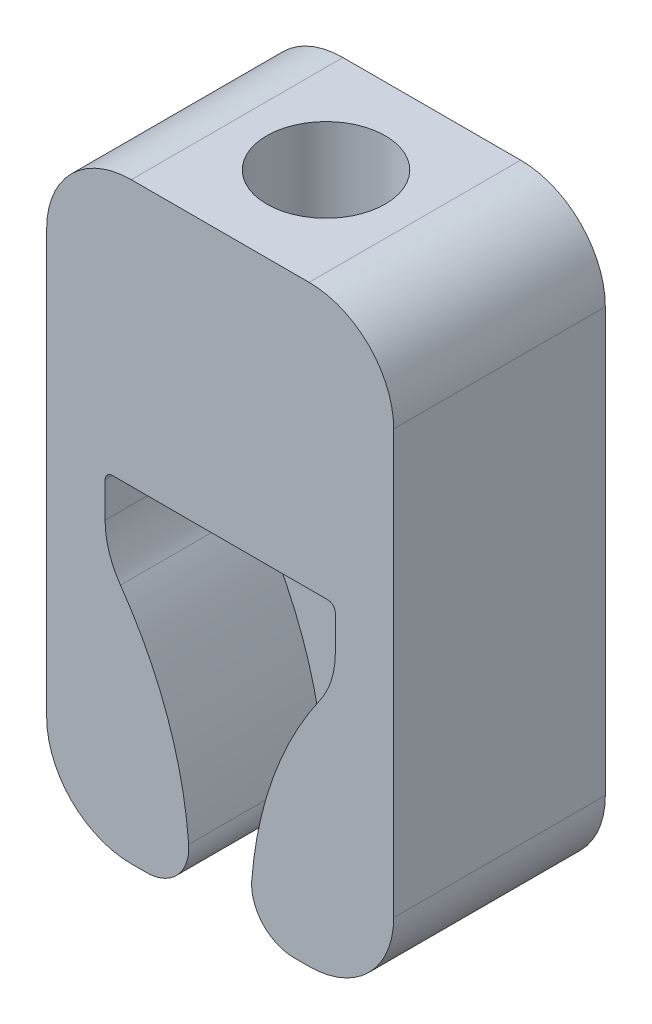
ISO-10303-21;
HEADER;
FILE_DESCRIPTION(('STEP AP214'),'2;1');
FILE_NAME('part.step','',(''),(''),'','','');
FILE_SCHEMA(('AUTOMOTIVE_DESIGN { 1 0 10303 214 1 1 1 1 }'));
ENDSEC;
DATA;
#1=APPLICATION_CONTEXT('core data for automotive mechanical design processes');
#2=APPLICATION_PROTOCOL_DEFINITION('international standard','automotive_design',2000,#1);
#3=PRODUCT_CONTEXT('',#1,'mechanical');
#4=PRODUCT('Part','Part','',(#3));
#5=PRODUCT_RELATED_PRODUCT_CATEGORY('part','',(#4));
#6=PRODUCT_DEFINITION_FORMATION('','',#4);
#7=PRODUCT_DEFINITION_CONTEXT('part definition',#1,'design');
#8=PRODUCT_DEFINITION('design','',#6,#7);
#9=PRODUCT_DEFINITION_SHAPE('','',#8);
#10=(LENGTH_UNIT() NAMED_UNIT(*) SI_UNIT(.MILLI.,.METRE.));
#11=(NAMED_UNIT(*) PLANE_ANGLE_UNIT() SI_UNIT($,.RADIAN.));
#12=(NAMED_UNIT(*) SI_UNIT($,.STERADIAN.) SOLID_ANGLE_UNIT());
#13=UNCERTAINTY_MEASURE_WITH_UNIT(LENGTH_MEASURE(1.E-05),#10,'distance_accuracy_value','');
#14=(GEOMETRIC_REPRESENTATION_CONTEXT(3) GLOBAL_UNCERTAINTY_ASSIGNED_CONTEXT((#13)) GLOBAL_UNIT_ASSIGNED_CONTEXT((#10,
#11,#12)) REPRESENTATION_CONTEXT('',''));
#15=CARTESIAN_POINT('',(0.,0.,0.));
#16=DIRECTION('',(0.,0.,1.));
#17=DIRECTION('',(1.,0.,0.));
#18=AXIS2_PLACEMENT_3D('',#15,#16,#17);
#19=CARTESIAN_POINT('',(20.5,35.,25.));
#20=DIRECTION('',(-1.,0.,0.));
#21=DIRECTION('',(0.,-1.,0.));
#22=AXIS2_PLACEMENT_3D('',#19,#20,#21);
#23=PLANE('',#22);
#24=DIRECTION('',(0.,1.,0.));
#25=VECTOR('',#24,1.);
#26=CARTESIAN_POINT('',(20.5,35.,0.));
#27=LINE('',#26,#25);
#28=CARTESIAN_POINT('',(20.5,-25.,0.));
#29=VERTEX_POINT('',#28);
#30=CARTESIAN_POINT('',(20.5,25.,0.));
#31=VERTEX_POINT('',#30);
#32=EDGE_CURVE('E218',#29,#31,#27,.T.);
#33=ORIENTED_EDGE('',*,*,#32,.T.);
#34=DIRECTION('',(0.,0.,-1.));
#35=VECTOR('',#34,1.);
#36=CARTESIAN_POINT('',(20.5,25.,25.));
#37=LINE('',#36,#35);
#38=CARTESIAN_POINT('',(20.5,25.,25.));
#39=VERTEX_POINT('',#38);
#40=EDGE_CURVE('E284',#31,#39,#37,.F.);
#41=ORIENTED_EDGE('',*,*,#40,.T.);
#42=DIRECTION('',(0.,1.,0.));
#43=VECTOR('',#42,1.);
#44=CARTESIAN_POINT('',(20.5,35.,25.));
#45=LINE('',#44,#43);
#46=CARTESIAN_POINT('',(20.5,-25.,25.));
#47=VERTEX_POINT('',#46);
#48=EDGE_CURVE('E244',#47,#39,#45,.T.);
#49=ORIENTED_EDGE('',*,*,#48,.F.);
#50=DIRECTION('',(0.,0.,-1.));
#51=VECTOR('',#50,1.);
#52=CARTESIAN_POINT('',(20.5,-25.,25.));
#53=LINE('',#52,#51);
#54=EDGE_CURVE('E281',#47,#29,#53,.T.);
#55=ORIENTED_EDGE('',*,*,#54,.T.);
#56=EDGE_LOOP('',(#33,#41,#49,#55));
#57=FACE_BOUND('',#56,.T.);
#58=ADVANCED_FACE('F44',(#57),#23,.F.);
#59=CARTESIAN_POINT('',(-20.5,35.,25.));
#60=DIRECTION('',(0.,-1.,0.));
#61=DIRECTION('',(0.,0.,-1.));
#62=AXIS2_PLACEMENT_3D('',#59,#60,#61);
#63=PLANE('',#62);
#64=CARTESIAN_POINT('',(0.,35.,12.5));
#65=DIRECTION('',(0.,1.,0.));
#66=DIRECTION('',(0.,0.,1.));
#67=AXIS2_PLACEMENT_3D('',#64,#65,#66);
#68=CIRCLE('',#67,6.99999999999999);
#69=CARTESIAN_POINT('',(0.,35.,19.5));
#70=VERTEX_POINT('',#69);
#71=EDGE_CURVE('E193',#70,#70,#68,.T.);
#72=ORIENTED_EDGE('',*,*,#71,.F.);
#73=EDGE_LOOP('',(#72));
#74=FACE_BOUND('',#73,.T.);
#75=DIRECTION('',(-1.,0.,0.));
#76=VECTOR('',#75,1.);
#77=CARTESIAN_POINT('',(-20.5,35.,25.));
#78=LINE('',#77,#76);
#79=CARTESIAN_POINT('',(10.5,35.,25.));
#80=VERTEX_POINT('',#79);
#81=CARTESIAN_POINT('',(-10.5,35.,25.));
#82=VERTEX_POINT('',#81);
#83=EDGE_CURVE('E247',#80,#82,#78,.T.);
#84=ORIENTED_EDGE('',*,*,#83,.F.);
#85=DIRECTION('',(0.,0.,-1.));
#86=VECTOR('',#85,1.);
#87=CARTESIAN_POINT('',(10.5,35.,25.));
#88=LINE('',#87,#86);
#89=CARTESIAN_POINT('',(10.5,35.,0.));
#90=VERTEX_POINT('',#89);
#91=EDGE_CURVE('E270',#80,#90,#88,.T.);
#92=ORIENTED_EDGE('',*,*,#91,.T.);
#93=DIRECTION('',(-1.,0.,0.));
#94=VECTOR('',#93,1.);
#95=CARTESIAN_POINT('',(-20.5,35.,0.));
#96=LINE('',#95,#94);
#97=CARTESIAN_POINT('',(-10.5,35.,0.));
#98=VERTEX_POINT('',#97);
#99=EDGE_CURVE('E261',#90,#98,#96,.T.);
#100=ORIENTED_EDGE('',*,*,#99,.T.);
#101=DIRECTION('',(0.,0.,-1.));
#102=VECTOR('',#101,1.);
#103=CARTESIAN_POINT('',(-10.5,35.,25.));
#104=LINE('',#103,#102);
#105=EDGE_CURVE('E258',#98,#82,#104,.F.);
#106=ORIENTED_EDGE('',*,*,#105,.T.);
#107=EDGE_LOOP('',(#84,#92,#100,#106));
#108=FACE_BOUND('',#107,.T.);
#109=ADVANCED_FACE('F370',(#74,#108),#63,.F.);
#110=CARTESIAN_POINT('',(-20.5,35.,25.));
#111=DIRECTION('',(1.,0.,0.));
#112=DIRECTION('',(0.,1.,0.));
#113=AXIS2_PLACEMENT_3D('',#110,#111,#112);
#114=PLANE('',#113);
#115=DIRECTION('',(0.,-1.,0.));
#116=VECTOR('',#115,1.);
#117=CARTESIAN_POINT('',(-20.5,35.,25.));
#118=LINE('',#117,#116);
#119=CARTESIAN_POINT('',(-20.5,25.,25.));
#120=VERTEX_POINT('',#119);
#121=CARTESIAN_POINT('',(-20.5,-25.,25.));
#122=VERTEX_POINT('',#121);
#123=EDGE_CURVE('E251',#120,#122,#118,.T.);
#124=ORIENTED_EDGE('',*,*,#123,.F.);
#125=DIRECTION('',(0.,0.,-1.));
#126=VECTOR('',#125,1.);
#127=CARTESIAN_POINT('',(-20.5,25.,25.));
#128=LINE('',#127,#126);
#129=CARTESIAN_POINT('',(-20.5,25.,0.));
#130=VERTEX_POINT('',#129);
#131=EDGE_CURVE('E296',#120,#130,#128,.T.);
#132=ORIENTED_EDGE('',*,*,#131,.T.);
#133=DIRECTION('',(0.,-1.,0.));
#134=VECTOR('',#133,1.);
#135=CARTESIAN_POINT('',(-20.5,35.,0.));
#136=LINE('',#135,#134);
#137=CARTESIAN_POINT('',(-20.5,-25.,0.));
#138=VERTEX_POINT('',#137);
#139=EDGE_CURVE('E264',#130,#138,#136,.T.);
#140=ORIENTED_EDGE('',*,*,#139,.T.);
#141=DIRECTION('',(0.,0.,-1.));
#142=VECTOR('',#141,1.);
#143=CARTESIAN_POINT('',(-20.5,-25.,25.));
#144=LINE('',#143,#142);
#145=EDGE_CURVE('E294',#138,#122,#144,.F.);
#146=ORIENTED_EDGE('',*,*,#145,.T.);
#147=EDGE_LOOP('',(#124,#132,#140,#146));
#148=FACE_BOUND('',#147,.T.);
#149=ADVANCED_FACE('F379',(#148),#114,.F.);
#150=CARTESIAN_POINT('',(-20.5,-35.,25.));
#151=DIRECTION('',(0.,1.,0.));
#152=DIRECTION('',(0.,0.,1.));
#153=AXIS2_PLACEMENT_3D('',#150,#151,#152);
#154=PLANE('',#153);
#155=DIRECTION('',(1.,0.,0.));
#156=VECTOR('',#155,1.);
#157=CARTESIAN_POINT('',(-20.5,-35.,25.));
#158=LINE('',#157,#156);
#159=CARTESIAN_POINT('',(8.71265864964173,-35.,25.));
#160=VERTEX_POINT('',#159);
#161=CARTESIAN_POINT('',(10.5,-35.,25.));
#162=VERTEX_POINT('',#161);
#163=EDGE_CURVE('E254',#160,#162,#158,.T.);
#164=ORIENTED_EDGE('',*,*,#163,.F.);
#165=DIRECTION('',(0.,0.,1.));
#166=VECTOR('',#165,1.);
#167=CARTESIAN_POINT('',(8.71265864964173,-35.,25.));
#168=LINE('',#167,#166);
#169=CARTESIAN_POINT('',(8.71265864964173,-35.,9.));
#170=VERTEX_POINT('',#169);
#171=EDGE_CURVE('E333',#160,#170,#168,.F.);
#172=ORIENTED_EDGE('',*,*,#171,.T.);
#173=DIRECTION('',(-1.,0.,0.));
#174=VECTOR('',#173,1.);
#175=CARTESIAN_POINT('',(3.6,-35.,9.));
#176=LINE('',#175,#174);
#177=CARTESIAN_POINT('',(-8.71265864964173,-35.,9.));
#178=VERTEX_POINT('',#177);
#179=EDGE_CURVE('E66',#170,#178,#176,.T.);
#180=ORIENTED_EDGE('',*,*,#179,.T.);
#181=DIRECTION('',(0.,0.,1.));
#182=VECTOR('',#181,1.);
#183=CARTESIAN_POINT('',(-8.71265864964173,-35.,25.));
#184=LINE('',#183,#182);
#185=CARTESIAN_POINT('',(-8.71265864964173,-35.,25.));
#186=VERTEX_POINT('',#185);
#187=EDGE_CURVE('E330',#178,#186,#184,.T.);
#188=ORIENTED_EDGE('',*,*,#187,.T.);
#189=CARTESIAN_POINT('',(-10.5,-35.,25.));
#190=VERTEX_POINT('',#189);
#191=EDGE_CURVE('E255',#190,#186,#158,.T.);
#192=ORIENTED_EDGE('',*,*,#191,.F.);
#193=DIRECTION('',(0.,0.,-1.));
#194=VECTOR('',#193,1.);
#195=CARTESIAN_POINT('',(-10.5,-35.,25.));
#196=LINE('',#195,#194);
#197=CARTESIAN_POINT('',(-10.5,-35.,0.));
#198=VERTEX_POINT('',#197);
#199=EDGE_CURVE('E299',#190,#198,#196,.T.);
#200=ORIENTED_EDGE('',*,*,#199,.T.);
#201=DIRECTION('',(1.,0.,0.));
#202=VECTOR('',#201,1.);
#203=CARTESIAN_POINT('',(-20.5,-35.,0.));
#204=LINE('',#203,#202);
#205=CARTESIAN_POINT('',(10.5,-35.,0.));
#206=VERTEX_POINT('',#205);
#207=EDGE_CURVE('E248',#198,#206,#204,.T.);
#208=ORIENTED_EDGE('',*,*,#207,.T.);
#209=DIRECTION('',(0.,0.,-1.));
#210=VECTOR('',#209,1.);
#211=CARTESIAN_POINT('',(10.5,-35.,25.));
#212=LINE('',#211,#210);
#213=EDGE_CURVE('E302',#206,#162,#212,.F.);
#214=ORIENTED_EDGE('',*,*,#213,.T.);
#215=EDGE_LOOP('',(#164,#172,#180,#188,#192,#200,#208,#214));
#216=FACE_BOUND('',#215,.T.);
#217=ADVANCED_FACE('F352',(#216),#154,.F.);
#218=CARTESIAN_POINT('',(0.,0.,25.));
#219=DIRECTION('',(0.,0.,1.));
#220=DIRECTION('',(1.,0.,0.));
#221=AXIS2_PLACEMENT_3D('',#218,#219,#220);
#222=PLANE('',#221);
#223=CARTESIAN_POINT('',(48.6,-33.,25.));
#224=DIRECTION('',(0.,0.,-1.));
#225=DIRECTION('',(1.,0.,0.));
#226=AXIS2_PLACEMENT_3D('',#223,#224,#225);
#227=CIRCLE('',#226,45.);
#228=CARTESIAN_POINT('',(3.72674098084696,-29.625,25.));
#229=VERTEX_POINT('',#228);
#230=CARTESIAN_POINT('',(11.7818181818182,-7.12681914407688,25.));
#231=VERTEX_POINT('',#230);
#232=EDGE_CURVE('E192',#229,#231,#227,.T.);
#233=ORIENTED_EDGE('',*,*,#232,.F.);
#234=CARTESIAN_POINT('',(8.71265864964173,-30.,25.));
#235=DIRECTION('',(0.,0.,1.));
#236=DIRECTION('',(1.,0.,0.));
#237=AXIS2_PLACEMENT_3D('',#234,#235,#236);
#238=CIRCLE('',#237,5.);
#239=EDGE_CURVE('E328',#229,#160,#238,.T.);
#240=ORIENTED_EDGE('',*,*,#239,.T.);
#241=ORIENTED_EDGE('',*,*,#163,.T.);
#242=CARTESIAN_POINT('',(10.5,-25.,25.));
#243=DIRECTION('',(0.,0.,1.));
#244=DIRECTION('',(1.,0.,0.));
#245=AXIS2_PLACEMENT_3D('',#242,#243,#244);
#246=CIRCLE('',#245,10.);
#247=EDGE_CURVE('E288',#162,#47,#246,.T.);
#248=ORIENTED_EDGE('',*,*,#247,.T.);
#249=ORIENTED_EDGE('',*,*,#48,.T.);
#250=CARTESIAN_POINT('',(10.5,25.,25.));
#251=DIRECTION('',(0.,0.,1.));
#252=DIRECTION('',(1.,0.,0.));
#253=AXIS2_PLACEMENT_3D('',#250,#251,#252);
#254=CIRCLE('',#253,10.);
#255=EDGE_CURVE('E292',#39,#80,#254,.T.);
#256=ORIENTED_EDGE('',*,*,#255,.T.);
#257=ORIENTED_EDGE('',*,*,#83,.T.);
#258=CARTESIAN_POINT('',(-10.5,25.,25.));
#259=DIRECTION('',(0.,0.,1.));
#260=DIRECTION('',(1.,0.,0.));
#261=AXIS2_PLACEMENT_3D('',#258,#259,#260);
#262=CIRCLE('',#261,10.);
#263=EDGE_CURVE('E290',#82,#120,#262,.T.);
#264=ORIENTED_EDGE('',*,*,#263,.T.);
#265=ORIENTED_EDGE('',*,*,#123,.T.);
#266=CARTESIAN_POINT('',(-10.5,-25.,25.));
#267=DIRECTION('',(0.,0.,1.));
#268=DIRECTION('',(1.,0.,0.));
#269=AXIS2_PLACEMENT_3D('',#266,#267,#268);
#270=CIRCLE('',#269,10.);
#271=EDGE_CURVE('E286',#122,#190,#270,.T.);
#272=ORIENTED_EDGE('',*,*,#271,.T.);
#273=ORIENTED_EDGE('',*,*,#191,.T.);
#274=CARTESIAN_POINT('',(-8.71265864964173,-30.,25.));
#275=DIRECTION('',(0.,0.,1.));
#276=DIRECTION('',(1.,0.,0.));
#277=AXIS2_PLACEMENT_3D('',#274,#275,#276);
#278=CIRCLE('',#277,5.);
#279=CARTESIAN_POINT('',(-3.72674098084696,-29.625,25.));
#280=VERTEX_POINT('',#279);
#281=EDGE_CURVE('E326',#186,#280,#278,.T.);
#282=ORIENTED_EDGE('',*,*,#281,.T.);
#283=CARTESIAN_POINT('',(-48.6,-33.,25.));
#284=DIRECTION('',(0.,0.,-1.));
#285=DIRECTION('',(1.,0.,0.));
#286=AXIS2_PLACEMENT_3D('',#283,#284,#285);
#287=CIRCLE('',#286,45.);
#288=CARTESIAN_POINT('',(-11.7818181818182,-7.1268191440769,25.));
#289=VERTEX_POINT('',#288);
#290=EDGE_CURVE('E233',#289,#280,#287,.T.);
#291=ORIENTED_EDGE('',*,*,#290,.F.);
#292=CARTESIAN_POINT('',(-3.6,-1.3772233983162,25.));
#293=DIRECTION('',(0.,0.,1.));
#294=DIRECTION('',(-1.,0.,0.));
#295=AXIS2_PLACEMENT_3D('',#292,#293,#294);
#296=CIRCLE('',#295,10.);
#297=CARTESIAN_POINT('',(-13.6,-1.3772233983162,25.));
#298=VERTEX_POINT('',#297);
#299=EDGE_CURVE('E230',#298,#289,#296,.T.);
#300=ORIENTED_EDGE('',*,*,#299,.F.);
#301=DIRECTION('',(0.,-1.,0.));
#302=VECTOR('',#301,1.);
#303=CARTESIAN_POINT('',(-13.6,-1.3772233983162,25.));
#304=LINE('',#303,#302);
#305=CARTESIAN_POINT('',(-13.6,2.72277660168381,25.));
#306=VERTEX_POINT('',#305);
#307=EDGE_CURVE('E228',#306,#298,#304,.T.);
#308=ORIENTED_EDGE('',*,*,#307,.F.);
#309=CARTESIAN_POINT('',(-12.7,2.72277660168381,25.));
#310=DIRECTION('',(0.,0.,1.));
#311=DIRECTION('',(1.,0.,0.));
#312=AXIS2_PLACEMENT_3D('',#309,#310,#311);
#313=CIRCLE('',#312,0.9);
#314=CARTESIAN_POINT('',(-12.7,3.6227766016838,25.));
#315=VERTEX_POINT('',#314);
#316=EDGE_CURVE('E321',#306,#315,#313,.F.);
#317=ORIENTED_EDGE('',*,*,#316,.T.);
#318=DIRECTION('',(-1.,0.,0.));
#319=VECTOR('',#318,1.);
#320=CARTESIAN_POINT('',(-13.6,3.6227766016838,25.));
#321=LINE('',#320,#319);
#322=CARTESIAN_POINT('',(12.7,3.6227766016838,25.));
#323=VERTEX_POINT('',#322);
#324=EDGE_CURVE('E225',#323,#315,#321,.T.);
#325=ORIENTED_EDGE('',*,*,#324,.F.);
#326=CARTESIAN_POINT('',(12.7,2.72277660168381,25.));
#327=DIRECTION('',(0.,0.,1.));
#328=DIRECTION('',(1.,0.,0.));
#329=AXIS2_PLACEMENT_3D('',#326,#327,#328);
#330=CIRCLE('',#329,0.9);
#331=CARTESIAN_POINT('',(13.6,2.72277660168381,25.));
#332=VERTEX_POINT('',#331);
#333=EDGE_CURVE('E319',#323,#332,#330,.F.);
#334=ORIENTED_EDGE('',*,*,#333,.T.);
#335=DIRECTION('',(0.,1.,0.));
#336=VECTOR('',#335,1.);
#337=CARTESIAN_POINT('',(13.6,3.6227766016838,25.));
#338=LINE('',#337,#336);
#339=CARTESIAN_POINT('',(13.6,-1.3772233983162,25.));
#340=VERTEX_POINT('',#339);
#341=EDGE_CURVE('E222',#340,#332,#338,.T.);
#342=ORIENTED_EDGE('',*,*,#341,.F.);
#343=CARTESIAN_POINT('',(3.6,-1.3772233983162,25.));
#344=DIRECTION('',(0.,0.,1.));
#345=DIRECTION('',(-1.,0.,0.));
#346=AXIS2_PLACEMENT_3D('',#343,#344,#345);
#347=CIRCLE('',#346,10.);
#348=EDGE_CURVE('E195',#231,#340,#347,.T.);
#349=ORIENTED_EDGE('',*,*,#348,.F.);
#350=EDGE_LOOP('',(#233,#240,#241,#248,#249,#256,#257,#264,#265,#272,#273,#282,#291,#300,#308,
#317,#325,#334,#342,#349));
#351=FACE_BOUND('',#350,.T.);
#352=ADVANCED_FACE('F349',(#351),#222,.T.);
#353=CARTESIAN_POINT('',(0.,0.,0.));
#354=DIRECTION('',(0.,0.,1.));
#355=DIRECTION('',(1.,0.,0.));
#356=AXIS2_PLACEMENT_3D('',#353,#354,#355);
#357=PLANE('',#356);
#358=ORIENTED_EDGE('',*,*,#99,.F.);
#359=CARTESIAN_POINT('',(10.5,25.,0.));
#360=DIRECTION('',(0.,0.,1.));
#361=DIRECTION('',(1.,0.,0.));
#362=AXIS2_PLACEMENT_3D('',#359,#360,#361);
#363=CIRCLE('',#362,10.);
#364=EDGE_CURVE('E279',#90,#31,#363,.F.);
#365=ORIENTED_EDGE('',*,*,#364,.T.);
#366=ORIENTED_EDGE('',*,*,#32,.F.);
#367=CARTESIAN_POINT('',(10.5,-25.,0.));
#368=DIRECTION('',(0.,0.,1.));
#369=DIRECTION('',(1.,0.,0.));
#370=AXIS2_PLACEMENT_3D('',#367,#368,#369);
#371=CIRCLE('',#370,10.);
#372=EDGE_CURVE('E275',#29,#206,#371,.F.);
#373=ORIENTED_EDGE('',*,*,#372,.T.);
#374=ORIENTED_EDGE('',*,*,#207,.F.);
#375=CARTESIAN_POINT('',(-10.5,-25.,0.));
#376=DIRECTION('',(0.,0.,1.));
#377=DIRECTION('',(1.,0.,0.));
#378=AXIS2_PLACEMENT_3D('',#375,#376,#377);
#379=CIRCLE('',#378,10.);
#380=EDGE_CURVE('E273',#198,#138,#379,.F.);
#381=ORIENTED_EDGE('',*,*,#380,.T.);
#382=ORIENTED_EDGE('',*,*,#139,.F.);
#383=CARTESIAN_POINT('',(-10.5,25.,0.));
#384=DIRECTION('',(0.,0.,1.));
#385=DIRECTION('',(1.,0.,0.));
#386=AXIS2_PLACEMENT_3D('',#383,#384,#385);
#387=CIRCLE('',#386,10.);
#388=EDGE_CURVE('E277',#130,#98,#387,.F.);
#389=ORIENTED_EDGE('',*,*,#388,.T.);
#390=EDGE_LOOP('',(#358,#365,#366,#373,#374,#381,#382,#389));
#391=FACE_BOUND('',#390,.T.);
#392=ADVANCED_FACE('F569',(#391),#357,.F.);
#393=CARTESIAN_POINT('',(-48.6,-33.,-41.7393784085224));
#394=DIRECTION('',(0.,0.,1.));
#395=DIRECTION('',(1.,0.,0.));
#396=AXIS2_PLACEMENT_3D('',#393,#394,#395);
#397=CYLINDRICAL_SURFACE('',#396,45.);
#398=ORIENTED_EDGE('',*,*,#290,.T.);
#399=DIRECTION('',(0.,0.,1.));
#400=VECTOR('',#399,1.);
#401=CARTESIAN_POINT('',(-3.72674098084695,-29.625,-41.7393784085224));
#402=LINE('',#401,#400);
#403=CARTESIAN_POINT('',(-3.72674098084696,-29.625,9.));
#404=VERTEX_POINT('',#403);
#405=EDGE_CURVE('E59',#280,#404,#402,.F.);
#406=ORIENTED_EDGE('',*,*,#405,.T.);
#407=CARTESIAN_POINT('',(-48.6,-33.,9.));
#408=DIRECTION('',(0.,0.,1.));
#409=DIRECTION('',(1.,0.,0.));
#410=AXIS2_PLACEMENT_3D('',#407,#408,#409);
#411=CIRCLE('',#410,45.);
#412=CARTESIAN_POINT('',(-11.7818181818182,-7.12681914407689,9.));
#413=VERTEX_POINT('',#412);
#414=EDGE_CURVE('E216',#404,#413,#411,.T.);
#415=ORIENTED_EDGE('',*,*,#414,.T.);
#416=DIRECTION('',(0.,0.,1.));
#417=VECTOR('',#416,1.);
#418=CARTESIAN_POINT('',(-11.7818181818182,-7.1268191440769,-41.7393784085224));
#419=LINE('',#418,#417);
#420=EDGE_CURVE('E204',#413,#289,#419,.T.);
#421=ORIENTED_EDGE('',*,*,#420,.T.);
#422=EDGE_LOOP('',(#398,#406,#415,#421));
#423=FACE_BOUND('',#422,.T.);
#424=ADVANCED_FACE('F391',(#423),#397,.T.);
#425=CARTESIAN_POINT('',(-3.6,-1.3772233983162,-41.7393784085224));
#426=DIRECTION('',(0.,0.,1.));
#427=DIRECTION('',(1.,0.,0.));
#428=AXIS2_PLACEMENT_3D('',#425,#426,#427);
#429=CYLINDRICAL_SURFACE('',#428,10.);
#430=CARTESIAN_POINT('',(-3.6,-1.3772233983162,9.));
#431=DIRECTION('',(0.,0.,1.));
#432=DIRECTION('',(1.,0.,0.));
#433=AXIS2_PLACEMENT_3D('',#430,#431,#432);
#434=CIRCLE('',#433,10.);
#435=CARTESIAN_POINT('',(-13.6,-1.3772233983162,9.));
#436=VERTEX_POINT('',#435);
#437=EDGE_CURVE('E214',#413,#436,#434,.F.);
#438=ORIENTED_EDGE('',*,*,#437,.T.);
#439=DIRECTION('',(0.,0.,1.));
#440=VECTOR('',#439,1.);
#441=CARTESIAN_POINT('',(-13.6,-1.3772233983162,-41.7393784085224));
#442=LINE('',#441,#440);
#443=EDGE_CURVE('E237',#436,#298,#442,.T.);
#444=ORIENTED_EDGE('',*,*,#443,.T.);
#445=ORIENTED_EDGE('',*,*,#299,.T.);
#446=ORIENTED_EDGE('',*,*,#420,.F.);
#447=EDGE_LOOP('',(#438,#444,#445,#446));
#448=FACE_BOUND('',#447,.T.);
#449=ADVANCED_FACE('F395',(#448),#429,.F.);
#450=CARTESIAN_POINT('',(-13.6,-1.3772233983162,-41.7393784085224));
#451=DIRECTION('',(-1.,0.,0.));
#452=DIRECTION('',(0.,0.,1.));
#453=AXIS2_PLACEMENT_3D('',#450,#451,#452);
#454=PLANE('',#453);
#455=DIRECTION('',(0.,1.,0.));
#456=VECTOR('',#455,1.);
#457=CARTESIAN_POINT('',(-13.6,-1.3772233983162,9.));
#458=LINE('',#457,#456);
#459=CARTESIAN_POINT('',(-13.6,2.72277660168381,9.));
#460=VERTEX_POINT('',#459);
#461=EDGE_CURVE('E211',#436,#460,#458,.T.);
#462=ORIENTED_EDGE('',*,*,#461,.T.);
#463=DIRECTION('',(0.,0.,1.));
#464=VECTOR('',#463,1.);
#465=CARTESIAN_POINT('',(-13.6,2.72277660168381,25.));
#466=LINE('',#465,#464);
#467=EDGE_CURVE('E316',#460,#306,#466,.T.);
#468=ORIENTED_EDGE('',*,*,#467,.T.);
#469=ORIENTED_EDGE('',*,*,#307,.T.);
#470=ORIENTED_EDGE('',*,*,#443,.F.);
#471=EDGE_LOOP('',(#462,#468,#469,#470));
#472=FACE_BOUND('',#471,.T.);
#473=ADVANCED_FACE('F400',(#472),#454,.F.);
#474=CARTESIAN_POINT('',(-13.6,3.6227766016838,-41.7393784085224));
#475=DIRECTION('',(0.,1.,0.));
#476=DIRECTION('',(0.,0.,1.));
#477=AXIS2_PLACEMENT_3D('',#474,#475,#476);
#478=PLANE('',#477);
#479=DIRECTION('',(1.,0.,0.));
#480=VECTOR('',#479,1.);
#481=CARTESIAN_POINT('',(-13.6,3.6227766016838,9.));
#482=LINE('',#481,#480);
#483=CARTESIAN_POINT('',(-12.7,3.6227766016838,9.));
#484=VERTEX_POINT('',#483);
#485=CARTESIAN_POINT('',(12.7,3.6227766016838,9.));
#486=VERTEX_POINT('',#485);
#487=EDGE_CURVE('E208',#484,#486,#482,.T.);
#488=ORIENTED_EDGE('',*,*,#487,.T.);
#489=DIRECTION('',(0.,0.,1.));
#490=VECTOR('',#489,1.);
#491=CARTESIAN_POINT('',(12.7,3.6227766016838,25.));
#492=LINE('',#491,#490);
#493=EDGE_CURVE('E307',#486,#323,#492,.T.);
#494=ORIENTED_EDGE('',*,*,#493,.T.);
#495=ORIENTED_EDGE('',*,*,#324,.T.);
#496=DIRECTION('',(0.,0.,1.));
#497=VECTOR('',#496,1.);
#498=CARTESIAN_POINT('',(-12.7,3.6227766016838,9.));
#499=LINE('',#498,#497);
#500=EDGE_CURVE('E305',#315,#484,#499,.F.);
#501=ORIENTED_EDGE('',*,*,#500,.T.);
#502=EDGE_LOOP('',(#488,#494,#495,#501));
#503=FACE_BOUND('',#502,.T.);
#504=ADVANCED_FACE('F409',(#503),#478,.F.);
#505=CARTESIAN_POINT('',(13.6,3.6227766016838,-41.7393784085224));
#506=DIRECTION('',(1.,0.,0.));
#507=DIRECTION('',(0.,0.,-1.));
#508=AXIS2_PLACEMENT_3D('',#505,#506,#507);
#509=PLANE('',#508);
#510=ORIENTED_EDGE('',*,*,#341,.T.);
#511=DIRECTION('',(0.,0.,1.));
#512=VECTOR('',#511,1.);
#513=CARTESIAN_POINT('',(13.6,2.72277660168381,9.));
#514=LINE('',#513,#512);
#515=CARTESIAN_POINT('',(13.6,2.72277660168381,9.));
#516=VERTEX_POINT('',#515);
#517=EDGE_CURVE('E310',#332,#516,#514,.F.);
#518=ORIENTED_EDGE('',*,*,#517,.T.);
#519=DIRECTION('',(0.,-1.,0.));
#520=VECTOR('',#519,1.);
#521=CARTESIAN_POINT('',(13.6,3.6227766016838,9.));
#522=LINE('',#521,#520);
#523=CARTESIAN_POINT('',(13.6,-1.3772233983162,9.));
#524=VERTEX_POINT('',#523);
#525=EDGE_CURVE('E206',#516,#524,#522,.T.);
#526=ORIENTED_EDGE('',*,*,#525,.T.);
#527=DIRECTION('',(0.,0.,1.));
#528=VECTOR('',#527,1.);
#529=CARTESIAN_POINT('',(13.6,-1.3772233983162,-41.7393784085224));
#530=LINE('',#529,#528);
#531=EDGE_CURVE('E240',#524,#340,#530,.T.);
#532=ORIENTED_EDGE('',*,*,#531,.T.);
#533=EDGE_LOOP('',(#510,#518,#526,#532));
#534=FACE_BOUND('',#533,.T.);
#535=ADVANCED_FACE('F417',(#534),#509,.F.);
#536=CARTESIAN_POINT('',(3.6,-1.3772233983162,-41.7393784085224));
#537=DIRECTION('',(0.,0.,1.));
#538=DIRECTION('',(1.,0.,0.));
#539=AXIS2_PLACEMENT_3D('',#536,#537,#538);
#540=CYLINDRICAL_SURFACE('',#539,10.);
#541=CARTESIAN_POINT('',(3.6,-1.3772233983162,9.));
#542=DIRECTION('',(0.,0.,1.));
#543=DIRECTION('',(1.,0.,0.));
#544=AXIS2_PLACEMENT_3D('',#541,#542,#543);
#545=CIRCLE('',#544,10.);
#546=CARTESIAN_POINT('',(11.7818181818182,-7.12681914407689,9.));
#547=VERTEX_POINT('',#546);
#548=EDGE_CURVE('E203',#524,#547,#545,.F.);
#549=ORIENTED_EDGE('',*,*,#548,.T.);
#550=DIRECTION('',(0.,0.,1.));
#551=VECTOR('',#550,1.);
#552=CARTESIAN_POINT('',(11.7818181818182,-7.12681914407688,-41.7393784085224));
#553=LINE('',#552,#551);
#554=EDGE_CURVE('E235',#547,#231,#553,.T.);
#555=ORIENTED_EDGE('',*,*,#554,.T.);
#556=ORIENTED_EDGE('',*,*,#348,.T.);
#557=ORIENTED_EDGE('',*,*,#531,.F.);
#558=EDGE_LOOP('',(#549,#555,#556,#557));
#559=FACE_BOUND('',#558,.T.);
#560=ADVANCED_FACE('F420',(#559),#540,.F.);
#561=CARTESIAN_POINT('',(48.6,-33.,-41.7393784085224));
#562=DIRECTION('',(0.,0.,1.));
#563=DIRECTION('',(1.,0.,0.));
#564=AXIS2_PLACEMENT_3D('',#561,#562,#563);
#565=CYLINDRICAL_SURFACE('',#564,45.);
#566=CARTESIAN_POINT('',(48.6,-33.,9.));
#567=DIRECTION('',(0.,0.,1.));
#568=DIRECTION('',(1.,0.,0.));
#569=AXIS2_PLACEMENT_3D('',#566,#567,#568);
#570=CIRCLE('',#569,45.);
#571=CARTESIAN_POINT('',(3.72674098084696,-29.625,9.));
#572=VERTEX_POINT('',#571);
#573=EDGE_CURVE('E200',#547,#572,#570,.T.);
#574=ORIENTED_EDGE('',*,*,#573,.T.);
#575=DIRECTION('',(0.,0.,1.));
#576=VECTOR('',#575,1.);
#577=CARTESIAN_POINT('',(3.72674098084695,-29.625,-41.7393784085224));
#578=LINE('',#577,#576);
#579=EDGE_CURVE('E323',#572,#229,#578,.T.);
#580=ORIENTED_EDGE('',*,*,#579,.T.);
#581=ORIENTED_EDGE('',*,*,#232,.T.);
#582=ORIENTED_EDGE('',*,*,#554,.F.);
#583=EDGE_LOOP('',(#574,#580,#581,#582));
#584=FACE_BOUND('',#583,.T.);
#585=ADVANCED_FACE('F344',(#584),#565,.T.);
#586=CARTESIAN_POINT('',(0.,0.,9.));
#587=DIRECTION('',(0.,0.,1.));
#588=DIRECTION('',(1.,0.,0.));
#589=AXIS2_PLACEMENT_3D('',#586,#587,#588);
#590=PLANE('',#589);
#591=ORIENTED_EDGE('',*,*,#525,.F.);
#592=CARTESIAN_POINT('',(12.7,2.72277660168381,9.));
#593=DIRECTION('',(0.,0.,1.));
#594=DIRECTION('',(1.,0.,0.));
#595=AXIS2_PLACEMENT_3D('',#592,#593,#594);
#596=CIRCLE('',#595,0.9);
#597=EDGE_CURVE('E314',#516,#486,#596,.T.);
#598=ORIENTED_EDGE('',*,*,#597,.T.);
#599=ORIENTED_EDGE('',*,*,#487,.F.);
#600=CARTESIAN_POINT('',(-12.7,2.72277660168381,9.));
#601=DIRECTION('',(0.,0.,1.));
#602=DIRECTION('',(1.,0.,0.));
#603=AXIS2_PLACEMENT_3D('',#600,#601,#602);
#604=CIRCLE('',#603,0.9);
#605=EDGE_CURVE('E312',#484,#460,#604,.T.);
#606=ORIENTED_EDGE('',*,*,#605,.T.);
#607=ORIENTED_EDGE('',*,*,#461,.F.);
#608=ORIENTED_EDGE('',*,*,#437,.F.);
#609=ORIENTED_EDGE('',*,*,#414,.F.);
#610=CARTESIAN_POINT('',(-8.71265864964173,-30.,9.));
#611=DIRECTION('',(0.,0.,1.));
#612=DIRECTION('',(1.,0.,0.));
#613=AXIS2_PLACEMENT_3D('',#610,#611,#612);
#614=CIRCLE('',#613,5.);
#615=EDGE_CURVE('E12',#404,#178,#614,.F.);
#616=ORIENTED_EDGE('',*,*,#615,.T.);
#617=ORIENTED_EDGE('',*,*,#179,.F.);
#618=CARTESIAN_POINT('',(8.71265864964173,-30.,9.));
#619=DIRECTION('',(0.,0.,1.));
#620=DIRECTION('',(1.,0.,0.));
#621=AXIS2_PLACEMENT_3D('',#618,#619,#620);
#622=CIRCLE('',#621,5.);
#623=EDGE_CURVE('E52',#170,#572,#622,.F.);
#624=ORIENTED_EDGE('',*,*,#623,.T.);
#625=ORIENTED_EDGE('',*,*,#573,.F.);
#626=ORIENTED_EDGE('',*,*,#548,.F.);
#627=EDGE_LOOP('',(#591,#598,#599,#606,#607,#608,#609,#616,#617,#624,#625,#626));
#628=FACE_BOUND('',#627,.T.);
#629=ADVANCED_FACE('F186',(#628),#590,.T.);
#630=CARTESIAN_POINT('',(0.,10.6227766016838,12.5));
#631=DIRECTION('',(0.,1.,0.));
#632=DIRECTION('',(0.,0.,1.));
#633=AXIS2_PLACEMENT_3D('',#630,#631,#632);
#634=CONICAL_SURFACE('',#633,6.99999999999999,1.02974425867665);
#635=CARTESIAN_POINT('',(0.,6.41675226849089,12.5));
#636=VERTEX_POINT('',#635);
#637=VERTEX_LOOP('',#636);
#638=FACE_BOUND('',#637,.T.);
#639=CARTESIAN_POINT('',(0.,10.6227766016838,12.5));
#640=DIRECTION('',(0.,1.,0.));
#641=DIRECTION('',(0.,0.,1.));
#642=AXIS2_PLACEMENT_3D('',#639,#640,#641);
#643=CIRCLE('',#642,6.99999999999999);
#644=CARTESIAN_POINT('',(0.,10.6227766016838,19.5));
#645=VERTEX_POINT('',#644);
#646=EDGE_CURVE('E190',#645,#645,#643,.T.);
#647=ORIENTED_EDGE('',*,*,#646,.T.);
#648=EDGE_LOOP('',(#647));
#649=FACE_BOUND('',#648,.T.);
#650=ADVANCED_FACE('F182',(#638,#649),#634,.F.);
#651=CARTESIAN_POINT('',(0.,35.,12.5));
#652=DIRECTION('',(0.,1.,0.));
#653=DIRECTION('',(0.,0.,1.));
#654=AXIS2_PLACEMENT_3D('',#651,#652,#653);
#655=CYLINDRICAL_SURFACE('',#654,6.99999999999999);
#656=ORIENTED_EDGE('',*,*,#646,.F.);
#657=EDGE_LOOP('',(#656));
#658=FACE_BOUND('',#657,.T.);
#659=ORIENTED_EDGE('',*,*,#71,.T.);
#660=EDGE_LOOP('',(#659));
#661=FACE_BOUND('',#660,.T.);
#662=ADVANCED_FACE('F185',(#658,#661),#655,.F.);
#663=CARTESIAN_POINT('',(10.5,25.,25.));
#664=DIRECTION('',(0.,0.,-1.));
#665=DIRECTION('',(-1.,0.,0.));
#666=AXIS2_PLACEMENT_3D('',#663,#664,#665);
#667=CYLINDRICAL_SURFACE('',#666,10.);
#668=ORIENTED_EDGE('',*,*,#255,.F.);
#669=ORIENTED_EDGE('',*,*,#40,.F.);
#670=ORIENTED_EDGE('',*,*,#364,.F.);
#671=ORIENTED_EDGE('',*,*,#91,.F.);
#672=EDGE_LOOP('',(#668,#669,#670,#671));
#673=FACE_BOUND('',#672,.T.);
#674=ADVANCED_FACE('F365',(#673),#667,.T.);
#675=CARTESIAN_POINT('',(-10.5,25.,25.));
#676=DIRECTION('',(0.,0.,-1.));
#677=DIRECTION('',(-1.,0.,0.));
#678=AXIS2_PLACEMENT_3D('',#675,#676,#677);
#679=CYLINDRICAL_SURFACE('',#678,10.);
#680=ORIENTED_EDGE('',*,*,#263,.F.);
#681=ORIENTED_EDGE('',*,*,#105,.F.);
#682=ORIENTED_EDGE('',*,*,#388,.F.);
#683=ORIENTED_EDGE('',*,*,#131,.F.);
#684=EDGE_LOOP('',(#680,#681,#682,#683));
#685=FACE_BOUND('',#684,.T.);
#686=ADVANCED_FACE('F374',(#685),#679,.T.);
#687=CARTESIAN_POINT('',(10.5,-25.,25.));
#688=DIRECTION('',(0.,0.,-1.));
#689=DIRECTION('',(-1.,0.,0.));
#690=AXIS2_PLACEMENT_3D('',#687,#688,#689);
#691=CYLINDRICAL_SURFACE('',#690,10.);
#692=ORIENTED_EDGE('',*,*,#247,.F.);
#693=ORIENTED_EDGE('',*,*,#213,.F.);
#694=ORIENTED_EDGE('',*,*,#372,.F.);
#695=ORIENTED_EDGE('',*,*,#54,.F.);
#696=EDGE_LOOP('',(#692,#693,#694,#695));
#697=FACE_BOUND('',#696,.T.);
#698=ADVANCED_FACE('F358',(#697),#691,.T.);
#699=CARTESIAN_POINT('',(-10.5,-25.,25.));
#700=DIRECTION('',(0.,0.,-1.));
#701=DIRECTION('',(-1.,0.,0.));
#702=AXIS2_PLACEMENT_3D('',#699,#700,#701);
#703=CYLINDRICAL_SURFACE('',#702,10.);
#704=ORIENTED_EDGE('',*,*,#271,.F.);
#705=ORIENTED_EDGE('',*,*,#145,.F.);
#706=ORIENTED_EDGE('',*,*,#380,.F.);
#707=ORIENTED_EDGE('',*,*,#199,.F.);
#708=EDGE_LOOP('',(#704,#705,#706,#707));
#709=FACE_BOUND('',#708,.T.);
#710=ADVANCED_FACE('F383',(#709),#703,.T.);
#711=CARTESIAN_POINT('',(12.7,2.72277660168381,-41.7393784085224));
#712=DIRECTION('',(0.,0.,-1.));
#713=DIRECTION('',(-1.,0.,0.));
#714=AXIS2_PLACEMENT_3D('',#711,#712,#713);
#715=CYLINDRICAL_SURFACE('',#714,0.9);
#716=ORIENTED_EDGE('',*,*,#597,.F.);
#717=ORIENTED_EDGE('',*,*,#517,.F.);
#718=ORIENTED_EDGE('',*,*,#333,.F.);
#719=ORIENTED_EDGE('',*,*,#493,.F.);
#720=EDGE_LOOP('',(#716,#717,#718,#719));
#721=FACE_BOUND('',#720,.T.);
#722=ADVANCED_FACE('F414',(#721),#715,.F.);
#723=CARTESIAN_POINT('',(-12.7,2.72277660168381,-41.7393784085224));
#724=DIRECTION('',(0.,0.,-1.));
#725=DIRECTION('',(-1.,0.,0.));
#726=AXIS2_PLACEMENT_3D('',#723,#724,#725);
#727=CYLINDRICAL_SURFACE('',#726,0.9);
#728=ORIENTED_EDGE('',*,*,#605,.F.);
#729=ORIENTED_EDGE('',*,*,#500,.F.);
#730=ORIENTED_EDGE('',*,*,#316,.F.);
#731=ORIENTED_EDGE('',*,*,#467,.F.);
#732=EDGE_LOOP('',(#728,#729,#730,#731));
#733=FACE_BOUND('',#732,.T.);
#734=ADVANCED_FACE('F405',(#733),#727,.F.);
#735=CARTESIAN_POINT('',(8.71265864964173,-30.,-41.7393784085224));
#736=DIRECTION('',(0.,0.,1.));
#737=DIRECTION('',(1.,0.,0.));
#738=AXIS2_PLACEMENT_3D('',#735,#736,#737);
#739=CYLINDRICAL_SURFACE('',#738,5.);
#740=ORIENTED_EDGE('',*,*,#623,.F.);
#741=ORIENTED_EDGE('',*,*,#171,.F.);
#742=ORIENTED_EDGE('',*,*,#239,.F.);
#743=ORIENTED_EDGE('',*,*,#579,.F.);
#744=EDGE_LOOP('',(#740,#741,#742,#743));
#745=FACE_BOUND('',#744,.T.);
#746=ADVANCED_FACE('F346',(#745),#739,.T.);
#747=CARTESIAN_POINT('',(-8.71265864964173,-30.,-41.7393784085224));
#748=DIRECTION('',(0.,0.,1.));
#749=DIRECTION('',(1.,0.,0.));
#750=AXIS2_PLACEMENT_3D('',#747,#748,#749);
#751=CYLINDRICAL_SURFACE('',#750,5.);
#752=ORIENTED_EDGE('',*,*,#615,.F.);
#753=ORIENTED_EDGE('',*,*,#405,.F.);
#754=ORIENTED_EDGE('',*,*,#281,.F.);
#755=ORIENTED_EDGE('',*,*,#187,.F.);
#756=EDGE_LOOP('',(#752,#753,#754,#755));
#757=FACE_BOUND('',#756,.T.);
#758=ADVANCED_FACE('F46',(#757),#751,.T.);
#759=CLOSED_SHELL('',(#58,#109,#149,#217,#352,#392,#424,#449,#473,#504,#535,#560,#585,#629,#650,
#662,#674,#686,#698,#710,#722,#734,#746,#758));
#760=MANIFOLD_SOLID_BREP('B2',#759);
#761=ADVANCED_BREP_SHAPE_REPRESENTATION('',(#18,#760),#14);
#762=SHAPE_DEFINITION_REPRESENTATION(#9,#761);
ENDSEC;
END-ISO-10303-21;
